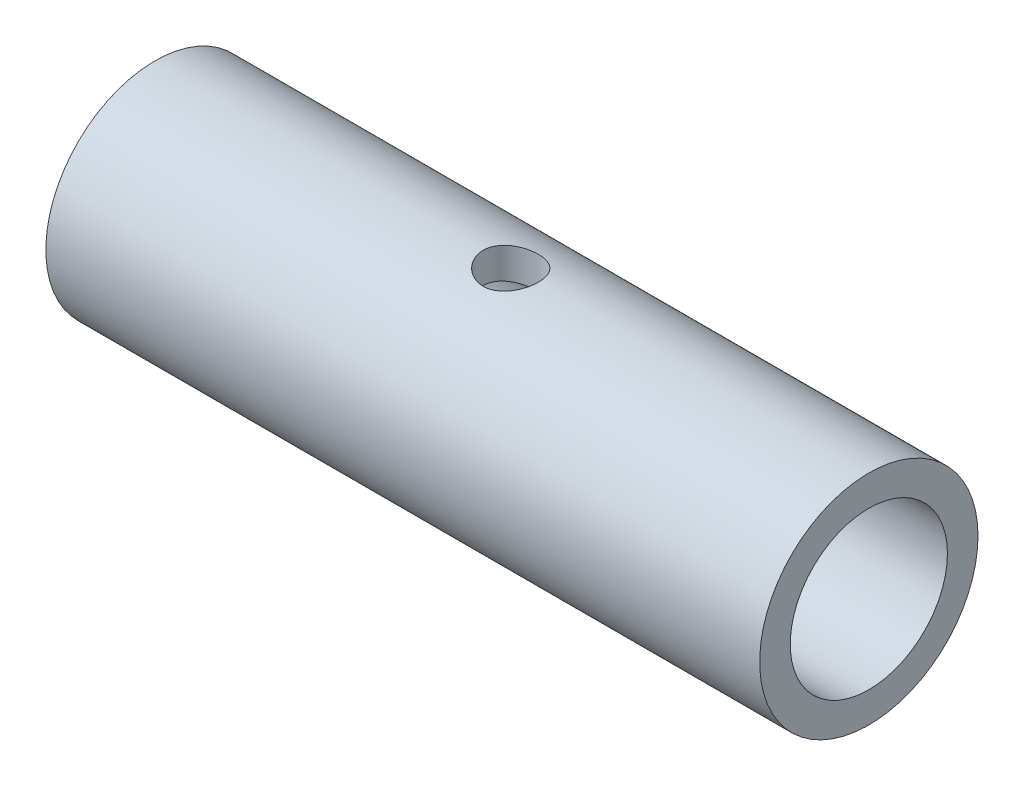
ISO-10303-21;
HEADER;
FILE_DESCRIPTION(('STEP AP214'),'2;1');
FILE_NAME('part.step','',(''),(''),'','','');
FILE_SCHEMA(('AUTOMOTIVE_DESIGN { 1 0 10303 214 1 1 1 1 }'));
ENDSEC;
DATA;
#1=APPLICATION_CONTEXT('core data for automotive mechanical design processes');
#2=APPLICATION_PROTOCOL_DEFINITION('international standard','automotive_design',2000,#1);
#3=PRODUCT_CONTEXT('',#1,'mechanical');
#4=PRODUCT('Part','Part','',(#3));
#5=PRODUCT_RELATED_PRODUCT_CATEGORY('part','',(#4));
#6=PRODUCT_DEFINITION_FORMATION('','',#4);
#7=PRODUCT_DEFINITION_CONTEXT('part definition',#1,'design');
#8=PRODUCT_DEFINITION('design','',#6,#7);
#9=PRODUCT_DEFINITION_SHAPE('','',#8);
#10=(LENGTH_UNIT() NAMED_UNIT(*) SI_UNIT(.MILLI.,.METRE.));
#11=(NAMED_UNIT(*) PLANE_ANGLE_UNIT() SI_UNIT($,.RADIAN.));
#12=(NAMED_UNIT(*) SI_UNIT($,.STERADIAN.) SOLID_ANGLE_UNIT());
#13=UNCERTAINTY_MEASURE_WITH_UNIT(LENGTH_MEASURE(1.E-05),#10,'distance_accuracy_value','');
#14=(GEOMETRIC_REPRESENTATION_CONTEXT(3) GLOBAL_UNCERTAINTY_ASSIGNED_CONTEXT((#13)) GLOBAL_UNIT_ASSIGNED_CONTEXT((#10,
#11,#12)) REPRESENTATION_CONTEXT('',''));
#15=CARTESIAN_POINT('',(0.,0.,0.));
#16=DIRECTION('',(0.,0.,1.));
#17=DIRECTION('',(1.,0.,0.));
#18=AXIS2_PLACEMENT_3D('',#15,#16,#17);
#19=CARTESIAN_POINT('',(31.1404,0.,0.));
#20=DIRECTION('',(1.,0.,0.));
#21=DIRECTION('',(0.,0.,-1.));
#22=AXIS2_PLACEMENT_3D('',#19,#20,#21);
#23=PLANE('',#22);
#24=CARTESIAN_POINT('',(31.1404,0.,0.));
#25=DIRECTION('',(1.,0.,0.));
#26=DIRECTION('',(0.,0.,-1.));
#27=AXIS2_PLACEMENT_3D('',#24,#25,#26);
#28=CIRCLE('',#27,9.525);
#29=CARTESIAN_POINT('',(31.1404,0.,-9.525));
#30=VERTEX_POINT('',#29);
#31=EDGE_CURVE('E10',#30,#30,#28,.T.);
#32=ORIENTED_EDGE('',*,*,#31,.T.);
#33=EDGE_LOOP('',(#32));
#34=FACE_BOUND('',#33,.T.);
#35=CARTESIAN_POINT('',(31.1404,0.,0.));
#36=DIRECTION('',(1.,0.,0.));
#37=DIRECTION('',(0.,0.,-1.));
#38=AXIS2_PLACEMENT_3D('',#35,#36,#37);
#39=CIRCLE('',#38,6.858);
#40=CARTESIAN_POINT('',(31.1404,0.,-6.858));
#41=VERTEX_POINT('',#40);
#42=EDGE_CURVE('E33',#41,#41,#39,.T.);
#43=ORIENTED_EDGE('',*,*,#42,.F.);
#44=EDGE_LOOP('',(#43));
#45=FACE_BOUND('',#44,.T.);
#46=ADVANCED_FACE('F15',(#34,#45),#23,.T.);
#47=CARTESIAN_POINT('',(-31.1404,0.,0.));
#48=DIRECTION('',(1.,0.,0.));
#49=DIRECTION('',(0.,0.,-1.));
#50=AXIS2_PLACEMENT_3D('',#47,#48,#49);
#51=PLANE('',#50);
#52=CARTESIAN_POINT('',(-31.1404,0.,0.));
#53=DIRECTION('',(1.,0.,0.));
#54=DIRECTION('',(0.,0.,-1.));
#55=AXIS2_PLACEMENT_3D('',#52,#53,#54);
#56=CIRCLE('',#55,9.525);
#57=CARTESIAN_POINT('',(-31.1404,0.,-9.525));
#58=VERTEX_POINT('',#57);
#59=EDGE_CURVE('E28',#58,#58,#56,.T.);
#60=ORIENTED_EDGE('',*,*,#59,.F.);
#61=EDGE_LOOP('',(#60));
#62=FACE_BOUND('',#61,.T.);
#63=CARTESIAN_POINT('',(-31.1404,0.,0.));
#64=DIRECTION('',(1.,0.,0.));
#65=DIRECTION('',(0.,0.,-1.));
#66=AXIS2_PLACEMENT_3D('',#63,#64,#65);
#67=CIRCLE('',#66,6.858);
#68=CARTESIAN_POINT('',(-31.1404,0.,-6.858));
#69=VERTEX_POINT('',#68);
#70=EDGE_CURVE('E62',#69,#69,#67,.T.);
#71=ORIENTED_EDGE('',*,*,#70,.T.);
#72=EDGE_LOOP('',(#71));
#73=FACE_BOUND('',#72,.T.);
#74=ADVANCED_FACE('F70',(#62,#73),#51,.F.);
#75=CARTESIAN_POINT('',(31.1404,0.,0.));
#76=DIRECTION('',(-1.,0.,0.));
#77=DIRECTION('',(0.,0.,1.));
#78=AXIS2_PLACEMENT_3D('',#75,#76,#77);
#79=CYLINDRICAL_SURFACE('',#78,9.525);
#80=CARTESIAN_POINT('',(-0.1016,-9.21428543078627,2.413));
#81=CARTESIAN_POINT('',(0.0315844394207791,-9.21428793639697,2.41299632192232));
#82=CARTESIAN_POINT('',(0.16480921992987,-9.21720456734644,2.40193585700803));
#83=CARTESIAN_POINT('',(0.427428753186837,-9.22852516961048,2.35805935843865));
#84=CARTESIAN_POINT('',(0.556821294072152,-9.23693224773675,2.32523100709667));
#85=CARTESIAN_POINT('',(0.807939641453416,-9.25822186105432,2.23895287767477));
#86=CARTESIAN_POINT('',(0.929675273373908,-9.27109851648187,2.18553018145421));
#87=CARTESIAN_POINT('',(1.16247058356803,-9.29986905667627,2.05966279386624));
#88=CARTESIAN_POINT('',(1.27352973376755,-9.31576309057146,1.98721716225777));
#89=CARTESIAN_POINT('',(1.48432848357206,-9.34917957421871,1.82361180530555));
#90=CARTESIAN_POINT('',(1.5837912931329,-9.36672860771954,1.73210080665042));
#91=CARTESIAN_POINT('',(1.76613388007255,-9.40124737523484,1.53371876949773));
#92=CARTESIAN_POINT('',(1.84901207509717,-9.41821705384452,1.42684626701413));
#93=CARTESIAN_POINT('',(1.99696951661439,-9.44995970089797,1.19887421234851));
#94=CARTESIAN_POINT('',(2.06177621277856,-9.46469764294377,1.07759247133314));
#95=CARTESIAN_POINT('',(2.1699778483772,-9.49001263006886,0.825420528557759));
#96=CARTESIAN_POINT('',(2.21337603451232,-9.50059030602262,0.694531787205158));
#97=CARTESIAN_POINT('',(2.27664036066084,-9.5162050062834,0.42974755564687));
#98=CARTESIAN_POINT('',(2.29697669437608,-9.52135258312599,0.295971040240008));
#99=CARTESIAN_POINT('',(2.31501661758326,-9.52591259152121,0.0268127422067791));
#100=CARTESIAN_POINT('',(2.3127236394845,-9.52532589284768,-0.108568793859064));
#101=CARTESIAN_POINT('',(2.28590682341191,-9.51856549768785,-0.373830809383349));
#102=CARTESIAN_POINT('',(2.26189060594633,-9.5125193803891,-0.503766349240137));
#103=CARTESIAN_POINT('',(2.19312578957057,-9.49566843408202,-0.757699469921245));
#104=CARTESIAN_POINT('',(2.14837607068301,-9.4848633480064,-0.881696729573661));
#105=CARTESIAN_POINT('',(2.03900807609398,-9.45951452853285,-1.12156270540417));
#106=CARTESIAN_POINT('',(1.97421046851789,-9.44493725301621,-1.2373459641052));
#107=CARTESIAN_POINT('',(1.82672240727533,-9.41362324597575,-1.45657235599479));
#108=CARTESIAN_POINT('',(1.74402876630491,-9.39688612999653,-1.56001328590286));
#109=CARTESIAN_POINT('',(1.56037992817606,-9.36252584411429,-1.75464665530158));
#110=CARTESIAN_POINT('',(1.45898130345457,-9.34489097594419,-1.84541908431528));
#111=CARTESIAN_POINT('',(1.24221670731962,-9.31114696923562,-2.0087667175165));
#112=CARTESIAN_POINT('',(1.12685004698427,-9.29503790602175,-2.08134102360606));
#113=CARTESIAN_POINT('',(0.884583447650895,-9.266126534717,-2.20651099248131));
#114=CARTESIAN_POINT('',(0.757627756592238,-9.25334148762954,-2.25900301050085));
#115=CARTESIAN_POINT('',(0.496290885833842,-9.2327456803203,-2.34176662795152));
#116=CARTESIAN_POINT('',(0.361911350731128,-9.22493382315658,-2.37204312770877));
#117=CARTESIAN_POINT('',(0.0934428941820414,-9.21539979817428,-2.40881412167068));
#118=CARTESIAN_POINT('',(-0.0405552664227236,-9.21351837999779,-2.4159307043807));
#119=CARTESIAN_POINT('',(-0.307825152196355,-9.2156243388942,-2.40788507222969));
#120=CARTESIAN_POINT('',(-0.441096945038221,-9.21961115952874,-2.39272496968961));
#121=CARTESIAN_POINT('',(-0.700804149157229,-9.23285153774554,-2.34110235461956));
#122=CARTESIAN_POINT('',(-0.827317045951347,-9.24201491537009,-2.30500431769763));
#123=CARTESIAN_POINT('',(-1.07249534671854,-9.26448982291117,-2.21293574281116));
#124=CARTESIAN_POINT('',(-1.19115979994686,-9.27780185427572,-2.15696280245184));
#125=CARTESIAN_POINT('',(-1.41990212143673,-9.30740778215537,-2.02543888640469));
#126=CARTESIAN_POINT('',(-1.52975966415047,-9.32375619814284,-1.94951727369401));
#127=CARTESIAN_POINT('',(-1.73540390876579,-9.35746016799382,-1.78071798430517));
#128=CARTESIAN_POINT('',(-1.83118822851138,-9.37481589167099,-1.68783744296504));
#129=CARTESIAN_POINT('',(-2.00849919906283,-9.40912030642822,-1.48489744966154));
#130=CARTESIAN_POINT('',(-2.08959482340314,-9.42604698269254,-1.37445698064202));
#131=CARTESIAN_POINT('',(-2.232090308165,-9.45712393176532,-1.14116545157765));
#132=CARTESIAN_POINT('',(-2.2934912025321,-9.47127435030825,-1.01831504348248));
#133=CARTESIAN_POINT('',(-2.39431442823812,-9.49511464989736,-0.764544855581737));
#134=CARTESIAN_POINT('',(-2.43389628681235,-9.50483681411777,-0.633691632901923));
#135=CARTESIAN_POINT('',(-2.49043389482846,-9.51886666860968,-0.366911091116921));
#136=CARTESIAN_POINT('',(-2.50739413616636,-9.52317543379117,-0.230984784868422));
#137=CARTESIAN_POINT('',(-2.51794873818627,-9.52584778637719,0.0380386630809051));
#138=CARTESIAN_POINT('',(-2.51217842644525,-9.52437303058764,0.171109645535167));
#139=CARTESIAN_POINT('',(-2.4788948187005,-9.51600391452607,0.434320605183303));
#140=CARTESIAN_POINT('',(-2.45138220134556,-9.50910972341246,0.564460673730231));
#141=CARTESIAN_POINT('',(-2.37573945477103,-9.49070278384709,0.817431154638578));
#142=CARTESIAN_POINT('',(-2.32772696442795,-9.47921641128704,0.940298787932478));
#143=CARTESIAN_POINT('',(-2.21255366924199,-9.45283293445416,1.17630405118778));
#144=CARTESIAN_POINT('',(-2.14539039455034,-9.43793539029633,1.28944042367131));
#145=CARTESIAN_POINT('',(-1.99189971163549,-9.40587755499541,1.505773581814));
#146=CARTESIAN_POINT('',(-1.90514314091863,-9.38867077305308,1.60865898042801));
#147=CARTESIAN_POINT('',(-1.71575802071469,-9.35413865454271,1.79862656259618));
#148=CARTESIAN_POINT('',(-1.61312542527418,-9.33681328883271,1.8857047053927));
#149=CARTESIAN_POINT('',(-1.39251823919917,-9.30362422803912,2.04323817927316));
#150=CARTESIAN_POINT('',(-1.27428585376251,-9.28779518248159,2.11334038795562));
#151=CARTESIAN_POINT('',(-1.02732909089317,-9.25986152143217,2.23256926978175));
#152=CARTESIAN_POINT('',(-0.898612277627339,-9.24775425038818,2.28171090841207));
#153=CARTESIAN_POINT('',(-0.658740282114636,-9.23048638328067,2.35047862082388));
#154=CARTESIAN_POINT('',(-0.54871279412488,-9.22445740270272,2.37387227850036));
#155=CARTESIAN_POINT('',(-0.326332970866215,-9.21635604825495,2.40513381780153));
#156=CARTESIAN_POINT('',(-0.213980846782257,-9.2142833165554,2.41300310355689));
#157=CARTESIAN_POINT('',(-0.1016,-9.21428543078627,2.413));
#158=B_SPLINE_CURVE_WITH_KNOTS('',3,(#80,#81,#82,#83,#84,#85,#86,#87,#88,#89,#90,#91,#92,#93,
#94,#95,#96,#97,#98,#99,#100,#101,#102,#103,#104,#105,#106,#107,#108,#109,#110,#111,#112,#113,
#114,#115,#116,#117,#118,#119,#120,#121,#122,#123,#124,#125,#126,#127,#128,#129,#130,#131,#132,
#133,#134,#135,#136,#137,#138,#139,#140,#141,#142,#143,#144,#145,#146,#147,#148,#149,#150,#151,
#152,#153,#154,#155,#156,#157),.UNSPECIFIED.,.T.,.F.,(4,2,2,2,2,2,2,2,2,2,2,2,2,2,2,2,2,2,2,2,2,
2,2,2,2,2,2,2,2,2,2,2,2,2,2,2,2,2,4),(0.,0.399140516714164,0.798507086076572,1.19735026433763,
1.59621315981563,2.00320412111307,2.41023389531841,2.82310593728579,3.23591534601336,
3.64014776292274,4.04431886688575,4.43928274266977,4.83426795600713,5.23289385203752,
5.63159080230733,6.04136176167382,6.45115293972214,6.86303140292986,7.2748189861491,
7.67545025930634,8.07604354623651,8.46986432753264,8.86373272844319,9.26551179599429,
9.66735879400403,10.0795613190245,10.4917422004504,10.9008680881015,11.3099127249452,
11.7076066497463,12.1052881617038,12.5007176110679,12.896198081477,13.3013667266064,
13.7066387982836,14.1197299114439,14.5325255889306,14.8693502740303,15.2061444929985),.UNSPECIFIED.);
#159=CARTESIAN_POINT('',(-0.1016,-9.21428543078627,2.413));
#160=VERTEX_POINT('',#159);
#161=EDGE_CURVE('E57',#160,#160,#158,.T.);
#162=ORIENTED_EDGE('',*,*,#161,.T.);
#163=EDGE_LOOP('',(#162));
#164=FACE_BOUND('',#163,.T.);
#165=CARTESIAN_POINT('',(-0.1016,9.21428543078626,2.413));
#166=CARTESIAN_POINT('',(-0.23478443942078,9.21428793639696,2.41299632192232));
#167=CARTESIAN_POINT('',(-0.36800921992987,9.21720456734644,2.40193585700803));
#168=CARTESIAN_POINT('',(-0.630628753186837,9.22852516961048,2.35805935843865));
#169=CARTESIAN_POINT('',(-0.760021294072152,9.23693224773675,2.32523100709667));
#170=CARTESIAN_POINT('',(-1.01113964145342,9.25822186105432,2.23895287767477));
#171=CARTESIAN_POINT('',(-1.13287527337391,9.27109851648187,2.18553018145421));
#172=CARTESIAN_POINT('',(-1.36567058356803,9.29986905667627,2.05966279386624));
#173=CARTESIAN_POINT('',(-1.47672973376755,9.31576309057146,1.98721716225777));
#174=CARTESIAN_POINT('',(-1.68752848357206,9.34917957421871,1.82361180530555));
#175=CARTESIAN_POINT('',(-1.7869912931329,9.36672860771954,1.73210080665042));
#176=CARTESIAN_POINT('',(-1.96933388007255,9.40124737523484,1.53371876949773));
#177=CARTESIAN_POINT('',(-2.05221207509717,9.41821705384452,1.42684626701413));
#178=CARTESIAN_POINT('',(-2.20016951661439,9.44995970089797,1.19887421234851));
#179=CARTESIAN_POINT('',(-2.26497621277856,9.46469764294377,1.07759247133314));
#180=CARTESIAN_POINT('',(-2.3731778483772,9.49001263006886,0.82542052855776));
#181=CARTESIAN_POINT('',(-2.41657603451232,9.50059030602262,0.694531787205159));
#182=CARTESIAN_POINT('',(-2.47984036066084,9.5162050062834,0.429747555646871));
#183=CARTESIAN_POINT('',(-2.50017669437608,9.52135258312599,0.295971040240009));
#184=CARTESIAN_POINT('',(-2.51821661758326,9.52591259152121,0.0268127422067798));
#185=CARTESIAN_POINT('',(-2.5159236394845,9.52532589284768,-0.108568793859063));
#186=CARTESIAN_POINT('',(-2.48910682341191,9.51856549768785,-0.373830809383349));
#187=CARTESIAN_POINT('',(-2.46509060594633,9.5125193803891,-0.503766349240137));
#188=CARTESIAN_POINT('',(-2.39632578957057,9.49566843408202,-0.757699469921245));
#189=CARTESIAN_POINT('',(-2.35157607068301,9.4848633480064,-0.881696729573661));
#190=CARTESIAN_POINT('',(-2.24220807609398,9.45951452853285,-1.12156270540417));
#191=CARTESIAN_POINT('',(-2.17741046851789,9.44493725301621,-1.2373459641052));
#192=CARTESIAN_POINT('',(-2.02992240727533,9.41362324597575,-1.45657235599479));
#193=CARTESIAN_POINT('',(-1.94722876630491,9.39688612999653,-1.56001328590286));
#194=CARTESIAN_POINT('',(-1.76357992817606,9.36252584411429,-1.75464665530158));
#195=CARTESIAN_POINT('',(-1.66218130345457,9.34489097594419,-1.84541908431528));
#196=CARTESIAN_POINT('',(-1.44541670731962,9.31114696923562,-2.0087667175165));
#197=CARTESIAN_POINT('',(-1.33005004698427,9.29503790602175,-2.08134102360606));
#198=CARTESIAN_POINT('',(-1.08778344765089,9.266126534717,-2.20651099248131));
#199=CARTESIAN_POINT('',(-0.960827756592238,9.25334148762954,-2.25900301050085));
#200=CARTESIAN_POINT('',(-0.699490885833843,9.2327456803203,-2.34176662795152));
#201=CARTESIAN_POINT('',(-0.565111350731128,9.22493382315658,-2.37204312770877));
#202=CARTESIAN_POINT('',(-0.296642894182041,9.21539979817428,-2.40881412167068));
#203=CARTESIAN_POINT('',(-0.162644733577277,9.21351837999779,-2.4159307043807));
#204=CARTESIAN_POINT('',(0.104625152196355,9.2156243388942,-2.40788507222969));
#205=CARTESIAN_POINT('',(0.237896945038222,9.21961115952874,-2.39272496968961));
#206=CARTESIAN_POINT('',(0.497604149157229,9.23285153774554,-2.34110235461956));
#207=CARTESIAN_POINT('',(0.624117045951346,9.24201491537009,-2.30500431769763));
#208=CARTESIAN_POINT('',(0.869295346718542,9.26448982291117,-2.21293574281115));
#209=CARTESIAN_POINT('',(0.987959799946855,9.27780185427572,-2.15696280245184));
#210=CARTESIAN_POINT('',(1.21670212143673,9.30740778215537,-2.02543888640469));
#211=CARTESIAN_POINT('',(1.32655966415047,9.32375619814284,-1.94951727369401));
#212=CARTESIAN_POINT('',(1.53220390876579,9.35746016799382,-1.78071798430517));
#213=CARTESIAN_POINT('',(1.62798822851138,9.37481589167099,-1.68783744296504));
#214=CARTESIAN_POINT('',(1.80529919906283,9.40912030642822,-1.48489744966154));
#215=CARTESIAN_POINT('',(1.88639482340314,9.42604698269254,-1.37445698064202));
#216=CARTESIAN_POINT('',(2.028890308165,9.45712393176532,-1.14116545157765));
#217=CARTESIAN_POINT('',(2.0902912025321,9.47127435030825,-1.01831504348248));
#218=CARTESIAN_POINT('',(2.19111442823812,9.49511464989736,-0.764544855581737));
#219=CARTESIAN_POINT('',(2.23069628681234,9.50483681411777,-0.633691632901922));
#220=CARTESIAN_POINT('',(2.28723389482846,9.51886666860968,-0.36691109111692));
#221=CARTESIAN_POINT('',(2.30419413616636,9.52317543379117,-0.230984784868422));
#222=CARTESIAN_POINT('',(2.31474873818627,9.52584778637719,0.0380386630809051));
#223=CARTESIAN_POINT('',(2.30897842644525,9.52437303058764,0.171109645535167));
#224=CARTESIAN_POINT('',(2.2756948187005,9.51600391452607,0.434320605183303));
#225=CARTESIAN_POINT('',(2.24818220134556,9.50910972341246,0.564460673730231));
#226=CARTESIAN_POINT('',(2.17253945477103,9.49070278384709,0.817431154638579));
#227=CARTESIAN_POINT('',(2.12452696442794,9.47921641128704,0.940298787932479));
#228=CARTESIAN_POINT('',(2.00935366924199,9.45283293445416,1.17630405118778));
#229=CARTESIAN_POINT('',(1.94219039455034,9.43793539029633,1.28944042367131));
#230=CARTESIAN_POINT('',(1.78869971163549,9.40587755499542,1.50577358181401));
#231=CARTESIAN_POINT('',(1.70194314091863,9.38867077305308,1.60865898042801));
#232=CARTESIAN_POINT('',(1.51255802071469,9.35413865454271,1.79862656259619));
#233=CARTESIAN_POINT('',(1.40992542527418,9.33681328883271,1.8857047053927));
#234=CARTESIAN_POINT('',(1.18931823919916,9.30362422803912,2.04323817927316));
#235=CARTESIAN_POINT('',(1.07108585376251,9.28779518248159,2.11334038795562));
#236=CARTESIAN_POINT('',(0.824129090893167,9.25986152143217,2.23256926978175));
#237=CARTESIAN_POINT('',(0.695412277627336,9.24775425038818,2.28171090841207));
#238=CARTESIAN_POINT('',(0.455540282114633,9.23048638328067,2.35047862082388));
#239=CARTESIAN_POINT('',(0.345512794124878,9.22445740270272,2.37387227850036));
#240=CARTESIAN_POINT('',(0.123132970866214,9.21635604825495,2.40513381780153));
#241=CARTESIAN_POINT('',(0.0107808467822563,9.2142833165554,2.41300310355689));
#242=CARTESIAN_POINT('',(-0.1016,9.21428543078626,2.413));
#243=B_SPLINE_CURVE_WITH_KNOTS('',3,(#165,#166,#167,#168,#169,#170,#171,#172,#173,#174,#175,
#176,#177,#178,#179,#180,#181,#182,#183,#184,#185,#186,#187,#188,#189,#190,#191,#192,#193,#194,
#195,#196,#197,#198,#199,#200,#201,#202,#203,#204,#205,#206,#207,#208,#209,#210,#211,#212,#213,
#214,#215,#216,#217,#218,#219,#220,#221,#222,#223,#224,#225,#226,#227,#228,#229,#230,#231,#232,
#233,#234,#235,#236,#237,#238,#239,#240,#241,#242),.UNSPECIFIED.,.T.,.F.,(4,2,2,2,2,2,2,2,2,2,2,
2,2,2,2,2,2,2,2,2,2,2,2,2,2,2,2,2,2,2,2,2,2,2,2,2,2,2,4),(0.,0.399140516714164,
0.798507086076572,1.19735026433763,1.59621315981563,2.00320412111307,2.41023389531841,
2.82310593728579,3.23591534601336,3.64014776292273,4.04431886688575,4.43928274266977,
4.83426795600713,5.23289385203752,5.63159080230733,6.04136176167382,6.45115293972214,
6.86303140292986,7.2748189861491,7.67545025930634,8.07604354623651,8.46986432753264,
8.86373272844318,9.26551179599429,9.66735879400403,10.0795613190245,10.4917422004504,
10.9008680881015,11.3099127249452,11.7076066497463,12.1052881617038,12.5007176110679,
12.896198081477,13.3013667266064,13.7066387982836,14.1197299114439,14.5325255889306,
14.8693502740303,15.2061444929985),.UNSPECIFIED.);
#244=CARTESIAN_POINT('',(-0.1016,9.21428543078626,2.413));
#245=VERTEX_POINT('',#244);
#246=EDGE_CURVE('E53',#245,#245,#243,.T.);
#247=ORIENTED_EDGE('',*,*,#246,.T.);
#248=EDGE_LOOP('',(#247));
#249=FACE_BOUND('',#248,.T.);
#250=ORIENTED_EDGE('',*,*,#31,.F.);
#251=EDGE_LOOP('',(#250));
#252=FACE_BOUND('',#251,.T.);
#253=ORIENTED_EDGE('',*,*,#59,.T.);
#254=EDGE_LOOP('',(#253));
#255=FACE_BOUND('',#254,.T.);
#256=ADVANCED_FACE('F17',(#164,#249,#252,#255),#79,.T.);
#257=CARTESIAN_POINT('',(31.1404,0.,0.));
#258=DIRECTION('',(-1.,0.,0.));
#259=DIRECTION('',(0.,0.,1.));
#260=AXIS2_PLACEMENT_3D('',#257,#258,#259);
#261=CYLINDRICAL_SURFACE('',#260,6.858);
#262=CARTESIAN_POINT('',(-0.1016,-6.41946999369886,2.413));
#263=CARTESIAN_POINT('',(0.0293527618917913,-6.41946803680309,2.41300228924528));
#264=CARTESIAN_POINT('',(0.160289591770114,-6.42352070805187,2.40230402916263));
#265=CARTESIAN_POINT('',(0.418254165287777,-6.43919686250801,2.35995937164126));
#266=CARTESIAN_POINT('',(0.545281617892476,-6.45082090794746,2.32831141852575));
#267=CARTESIAN_POINT('',(0.791642055032241,-6.48016362480678,2.2453408537952));
#268=CARTESIAN_POINT('',(0.910990899439506,-6.49786922159086,2.19406042286443));
#269=CARTESIAN_POINT('',(1.1394341149545,-6.53736018556584,2.07342716349615));
#270=CARTESIAN_POINT('',(1.24852583191808,-6.55914660437428,2.00406967483894));
#271=CARTESIAN_POINT('',(1.45812061124449,-6.60541071344454,1.84600768079048));
#272=CARTESIAN_POINT('',(1.55811139078251,-6.62996087494923,1.75664491422206));
#273=CARTESIAN_POINT('',(1.74204191227152,-6.6783772767707,1.56251034508334));
#274=CARTESIAN_POINT('',(1.82597873137061,-6.70224339187594,1.45773574270029));
#275=CARTESIAN_POINT('',(1.977804226814,-6.74745129924572,1.23194427787278));
#276=CARTESIAN_POINT('',(2.04514749632597,-6.76869805285573,1.11053995674252));
#277=CARTESIAN_POINT('',(2.15824816888369,-6.80541206053832,0.857248307478071));
#278=CARTESIAN_POINT('',(2.2040121008749,-6.82088106240613,0.725364164200377));
#279=CARTESIAN_POINT('',(2.27089234930562,-6.84378285304158,0.460234188467397));
#280=CARTESIAN_POINT('',(2.2928881225222,-6.85150157472657,0.327235371586356));
#281=CARTESIAN_POINT('',(2.31441331181462,-6.85905290182181,0.0592254374982949));
#282=CARTESIAN_POINT('',(2.31394916643622,-6.85888776728358,-0.0757850919199757));
#283=CARTESIAN_POINT('',(2.29110590468652,-6.85087866296873,-0.337727391881213));
#284=CARTESIAN_POINT('',(2.26968396359488,-6.84337008472238,-0.464754611872771));
#285=CARTESIAN_POINT('',(2.20712777239434,-6.82194695701712,-0.713280256742418));
#286=CARTESIAN_POINT('',(2.16599215335145,-6.80803196269406,-0.834778297028087));
#287=CARTESIAN_POINT('',(2.06466797047543,-6.77495354836393,-1.07078294978835));
#288=CARTESIAN_POINT('',(2.00422352538858,-6.75572013708334,-1.18516948927064));
#289=CARTESIAN_POINT('',(1.8662145565604,-6.71398317175836,-1.40244500750423));
#290=CARTESIAN_POINT('',(1.78864491304488,-6.69147864046396,-1.50533053401072));
#291=CARTESIAN_POINT('',(1.61385343572165,-6.64416620583444,-1.70235707201577));
#292=CARTESIAN_POINT('',(1.51581860728298,-6.61929938217737,-1.79576377356377));
#293=CARTESIAN_POINT('',(1.30528906177412,-6.57103104899852,-1.9650658056875));
#294=CARTESIAN_POINT('',(1.19279156101209,-6.54762982285939,-2.04095775724431));
#295=CARTESIAN_POINT('',(0.953960298370371,-6.50459797991905,-2.17425368882045));
#296=CARTESIAN_POINT('',(0.827419116602573,-6.48504039383293,-2.23131144753184));
#297=CARTESIAN_POINT('',(0.565659091105594,-6.45275246542151,-2.32304601571246));
#298=CARTESIAN_POINT('',(0.430444422859309,-6.44001886518862,-2.35773350680756));
#299=CARTESIAN_POINT('',(0.162354963773079,-6.4235711713039,-2.40217283995223));
#300=CARTESIAN_POINT('',(0.0296965582454196,-6.41944118148973,-2.41307575250114));
#301=CARTESIAN_POINT('',(-0.235590046278454,-6.4194990882364,-2.41292349621297));
#302=CARTESIAN_POINT('',(-0.368218245784419,-6.42368524365801,-2.40187292374511));
#303=CARTESIAN_POINT('',(-0.624164818083922,-6.43948566613236,-2.3591661174322));
#304=CARTESIAN_POINT('',(-0.747643645234376,-6.45079773571998,-2.32834729299484));
#305=CARTESIAN_POINT('',(-0.987640013477242,-6.47923166677755,-2.24800449261524));
#306=CARTESIAN_POINT('',(-1.10415622980173,-6.49635462976613,-2.19847697003249));
#307=CARTESIAN_POINT('',(-1.33136214965818,-6.53520743346915,-2.08019683864644));
#308=CARTESIAN_POINT('',(-1.441714199193,-6.55707532489289,-2.01084224881655));
#309=CARTESIAN_POINT('',(-1.6496272240603,-6.60270206180711,-1.85554044382967));
#310=CARTESIAN_POINT('',(-1.74718400580762,-6.62646152317057,-1.76958781145273));
#311=CARTESIAN_POINT('',(-1.93224914472072,-6.67476222338438,-1.57796777428888));
#312=CARTESIAN_POINT('',(-2.01891853131635,-6.69927536081031,-1.47148043391289));
#313=CARTESIAN_POINT('',(-2.17323204536872,-6.74505826731624,-1.24486808884559));
#314=CARTESIAN_POINT('',(-2.24087658412618,-6.76632810650898,-1.12474337906123));
#315=CARTESIAN_POINT('',(-2.35465831785338,-6.80315920567997,-0.874674230467651));
#316=CARTESIAN_POINT('',(-2.40091240828047,-6.81875139115867,-0.744787783575028));
#317=CARTESIAN_POINT('',(-2.4706976356566,-6.84259672512985,-0.478414438588867));
#318=CARTESIAN_POINT('',(-2.49423802666424,-6.85085286238051,-0.341930252379054));
#319=CARTESIAN_POINT('',(-2.51702169323287,-6.85884506415907,-0.0738682227472687));
#320=CARTESIAN_POINT('',(-2.51746348123855,-6.85900139751255,0.0575962427297921));
#321=CARTESIAN_POINT('',(-2.49704842715223,-6.85183746377642,0.318640014079514));
#322=CARTESIAN_POINT('',(-2.4761936575792,-6.84451792421697,0.448219502148126));
#323=CARTESIAN_POINT('',(-2.41459614260088,-6.82339623233272,0.699292539081117));
#324=CARTESIAN_POINT('',(-2.37424636669136,-6.80972236661764,0.820894082135225));
#325=CARTESIAN_POINT('',(-2.27517887486929,-6.77730449369903,1.05563385651689));
#326=CARTESIAN_POINT('',(-2.21645773642079,-6.75855954185375,1.16877050598675));
#327=CARTESIAN_POINT('',(-2.07966379060745,-6.71698797510637,1.38823837672135));
#328=CARTESIAN_POINT('',(-2.00091968428245,-6.69402964167263,1.49412583578466));
#329=CARTESIAN_POINT('',(-1.82741964925282,-6.64688543913843,1.69156731004538));
#330=CARTESIAN_POINT('',(-1.7326583268294,-6.62269915845865,1.78311647681933));
#331=CARTESIAN_POINT('',(-1.52473180413766,-6.57451415683132,1.95349066580963));
#332=CARTESIAN_POINT('',(-1.41093072801798,-6.55057275593336,2.03155857789187));
#333=CARTESIAN_POINT('',(-1.17106741098975,-6.50687954460864,2.16744075713882));
#334=CARTESIAN_POINT('',(-1.04500656612844,-6.48712725797095,2.22525732692691));
#335=CARTESIAN_POINT('',(-0.784961879900738,-6.45446283978022,2.31829871972636));
#336=CARTESIAN_POINT('',(-0.651041353188193,-6.44150266215901,2.35368261168955));
#337=CARTESIAN_POINT('',(-0.378606508604039,-6.42400922155763,2.40102662747606));
#338=CARTESIAN_POINT('',(-0.240094344348847,-6.41947206329245,2.41299757891686));
#339=CARTESIAN_POINT('',(-0.1016,-6.41946999369886,2.413));
#340=B_SPLINE_CURVE_WITH_KNOTS('',3,(#262,#263,#264,#265,#266,#267,#268,#269,#270,#271,#272,
#273,#274,#275,#276,#277,#278,#279,#280,#281,#282,#283,#284,#285,#286,#287,#288,#289,#290,#291,
#292,#293,#294,#295,#296,#297,#298,#299,#300,#301,#302,#303,#304,#305,#306,#307,#308,#309,#310,
#311,#312,#313,#314,#315,#316,#317,#318,#319,#320,#321,#322,#323,#324,#325,#326,#327,#328,#329,
#330,#331,#332,#333,#334,#335,#336,#337,#338,#339),.UNSPECIFIED.,.T.,.F.,(4,2,2,2,2,2,2,2,2,2,2,
2,2,2,2,2,2,2,2,2,2,2,2,2,2,2,2,2,2,2,2,2,2,2,2,2,2,2,4),(0.,0.392344180891874,
0.784717499643502,1.17625248675133,1.56788851059697,1.9750582891819,2.38230212839875,
2.80153911273494,3.22064917313412,3.62365608562375,4.0265474695085,4.411858104656,
4.79719549996823,5.18786742418496,5.57865630279065,5.98979418246255,6.40101131439327,
6.81941385206127,7.23761645761571,7.63508401395676,8.03246836186377,8.4140405204528,
8.7956850506722,9.19043998595355,9.58532397860401,10.0017589882339,10.4181849942073,
10.8323075931194,11.2462613980825,11.6387139370268,12.0311282872722,12.4159431878128,
12.8008298210776,13.200880975965,13.6010671154832,14.019245145711,14.4373756127052,
14.8525069619284,15.2674462828463),.UNSPECIFIED.);
#341=CARTESIAN_POINT('',(-0.1016,-6.41946999369886,2.413));
#342=VERTEX_POINT('',#341);
#343=EDGE_CURVE('E20',#342,#342,#340,.T.);
#344=ORIENTED_EDGE('',*,*,#343,.F.);
#345=EDGE_LOOP('',(#344));
#346=FACE_BOUND('',#345,.T.);
#347=CARTESIAN_POINT('',(-0.1016,6.41946999369886,2.413));
#348=CARTESIAN_POINT('',(-0.232552761891792,6.41946803680309,2.41300228924528));
#349=CARTESIAN_POINT('',(-0.363489591770114,6.42352070805187,2.40230402916263));
#350=CARTESIAN_POINT('',(-0.621454165287777,6.43919686250801,2.35995937164126));
#351=CARTESIAN_POINT('',(-0.748481617892476,6.45082090794746,2.32831141852575));
#352=CARTESIAN_POINT('',(-0.994842055032241,6.48016362480678,2.24534085379521));
#353=CARTESIAN_POINT('',(-1.11419089943951,6.49786922159086,2.19406042286443));
#354=CARTESIAN_POINT('',(-1.3426341149545,6.53736018556584,2.07342716349615));
#355=CARTESIAN_POINT('',(-1.45172583191808,6.55914660437428,2.00406967483894));
#356=CARTESIAN_POINT('',(-1.66132061124449,6.60541071344454,1.84600768079048));
#357=CARTESIAN_POINT('',(-1.76131139078251,6.62996087494923,1.75664491422206));
#358=CARTESIAN_POINT('',(-1.94524191227152,6.67837727677069,1.56251034508335));
#359=CARTESIAN_POINT('',(-2.02917873137061,6.70224339187594,1.45773574270029));
#360=CARTESIAN_POINT('',(-2.181004226814,6.74745129924572,1.23194427787279));
#361=CARTESIAN_POINT('',(-2.24834749632597,6.76869805285573,1.11053995674252));
#362=CARTESIAN_POINT('',(-2.36144816888369,6.80541206053832,0.857248307478073));
#363=CARTESIAN_POINT('',(-2.4072121008749,6.82088106240612,0.725364164200379));
#364=CARTESIAN_POINT('',(-2.47409234930562,6.84378285304158,0.460234188467399));
#365=CARTESIAN_POINT('',(-2.4960881225222,6.85150157472657,0.327235371586358));
#366=CARTESIAN_POINT('',(-2.51761331181463,6.85905290182181,0.0592254374982968));
#367=CARTESIAN_POINT('',(-2.51714916643622,6.85888776728358,-0.0757850919199737));
#368=CARTESIAN_POINT('',(-2.49430590468652,6.85087866296873,-0.337727391881211));
#369=CARTESIAN_POINT('',(-2.47288396359489,6.84337008472238,-0.464754611872769));
#370=CARTESIAN_POINT('',(-2.41032777239434,6.82194695701712,-0.713280256742417));
#371=CARTESIAN_POINT('',(-2.36919215335145,6.80803196269406,-0.834778297028086));
#372=CARTESIAN_POINT('',(-2.26786797047543,6.77495354836393,-1.07078294978835));
#373=CARTESIAN_POINT('',(-2.20742352538858,6.75572013708334,-1.18516948927063));
#374=CARTESIAN_POINT('',(-2.0694145565604,6.71398317175836,-1.40244500750423));
#375=CARTESIAN_POINT('',(-1.99184491304488,6.69147864046396,-1.50533053401072));
#376=CARTESIAN_POINT('',(-1.81705343572165,6.64416620583444,-1.70235707201577));
#377=CARTESIAN_POINT('',(-1.71901860728298,6.61929938217737,-1.79576377356377));
#378=CARTESIAN_POINT('',(-1.50848906177412,6.57103104899852,-1.9650658056875));
#379=CARTESIAN_POINT('',(-1.39599156101209,6.54762982285939,-2.04095775724431));
#380=CARTESIAN_POINT('',(-1.15716029837037,6.50459797991905,-2.17425368882045));
#381=CARTESIAN_POINT('',(-1.03061911660257,6.48504039383293,-2.23131144753184));
#382=CARTESIAN_POINT('',(-0.768859091105594,6.45275246542151,-2.32304601571246));
#383=CARTESIAN_POINT('',(-0.633644422859309,6.44001886518862,-2.35773350680756));
#384=CARTESIAN_POINT('',(-0.365554963773081,6.4235711713039,-2.40217283995223));
#385=CARTESIAN_POINT('',(-0.232896558245421,6.41944118148973,-2.41307575250114));
#386=CARTESIAN_POINT('',(0.0323900462784526,6.4194990882364,-2.41292349621297));
#387=CARTESIAN_POINT('',(0.165018245784417,6.42368524365801,-2.40187292374511));
#388=CARTESIAN_POINT('',(0.420964818083919,6.43948566613236,-2.3591661174322));
#389=CARTESIAN_POINT('',(0.544443645234373,6.45079773571998,-2.32834729299484));
#390=CARTESIAN_POINT('',(0.784440013477238,6.47923166677755,-2.24800449261524));
#391=CARTESIAN_POINT('',(0.900956229801731,6.49635462976613,-2.19847697003249));
#392=CARTESIAN_POINT('',(1.12816214965817,6.53520743346915,-2.08019683864644));
#393=CARTESIAN_POINT('',(1.23851419919299,6.55707532489289,-2.01084224881655));
#394=CARTESIAN_POINT('',(1.4464272240603,6.60270206180711,-1.85554044382967));
#395=CARTESIAN_POINT('',(1.54398400580762,6.62646152317057,-1.76958781145273));
#396=CARTESIAN_POINT('',(1.72904914472071,6.67476222338437,-1.57796777428889));
#397=CARTESIAN_POINT('',(1.81571853131635,6.69927536081031,-1.47148043391289));
#398=CARTESIAN_POINT('',(1.97003204536871,6.74505826731624,-1.24486808884559));
#399=CARTESIAN_POINT('',(2.03767658412618,6.76632810650897,-1.12474337906123));
#400=CARTESIAN_POINT('',(2.15145831785338,6.80315920567997,-0.874674230467654));
#401=CARTESIAN_POINT('',(2.19771240828047,6.81875139115867,-0.744787783575031));
#402=CARTESIAN_POINT('',(2.2674976356566,6.84259672512985,-0.478414438588869));
#403=CARTESIAN_POINT('',(2.29103802666424,6.85085286238051,-0.341930252379056));
#404=CARTESIAN_POINT('',(2.31382169323287,6.85884506415907,-0.0738682227472709));
#405=CARTESIAN_POINT('',(2.31426348123855,6.85900139751255,0.0575962427297904));
#406=CARTESIAN_POINT('',(2.29384842715223,6.85183746377642,0.318640014079513));
#407=CARTESIAN_POINT('',(2.2729936575792,6.84451792421697,0.448219502148124));
#408=CARTESIAN_POINT('',(2.21139614260088,6.82339623233272,0.699292539081115));
#409=CARTESIAN_POINT('',(2.17104636669136,6.80972236661764,0.820894082135224));
#410=CARTESIAN_POINT('',(2.07197887486929,6.77730449369903,1.05563385651689));
#411=CARTESIAN_POINT('',(2.01325773642079,6.75855954185375,1.16877050598675));
#412=CARTESIAN_POINT('',(1.87646379060745,6.71698797510637,1.38823837672135));
#413=CARTESIAN_POINT('',(1.79771968428245,6.69402964167263,1.49412583578466));
#414=CARTESIAN_POINT('',(1.62421964925282,6.64688543913843,1.69156731004538));
#415=CARTESIAN_POINT('',(1.5294583268294,6.62269915845865,1.78311647681933));
#416=CARTESIAN_POINT('',(1.32153180413766,6.57451415683132,1.95349066580963));
#417=CARTESIAN_POINT('',(1.20773072801798,6.55057275593336,2.03155857789187));
#418=CARTESIAN_POINT('',(0.967867410989751,6.50687954460864,2.16744075713881));
#419=CARTESIAN_POINT('',(0.841806566128441,6.48712725797095,2.22525732692691));
#420=CARTESIAN_POINT('',(0.581761879900738,6.45446283978022,2.31829871972636));
#421=CARTESIAN_POINT('',(0.447841353188193,6.44150266215901,2.35368261168955));
#422=CARTESIAN_POINT('',(0.175406508604038,6.42400922155763,2.40102662747606));
#423=CARTESIAN_POINT('',(0.0368943443488467,6.41947206329244,2.41299757891686));
#424=CARTESIAN_POINT('',(-0.1016,6.41946999369886,2.413));
#425=B_SPLINE_CURVE_WITH_KNOTS('',3,(#347,#348,#349,#350,#351,#352,#353,#354,#355,#356,#357,
#358,#359,#360,#361,#362,#363,#364,#365,#366,#367,#368,#369,#370,#371,#372,#373,#374,#375,#376,
#377,#378,#379,#380,#381,#382,#383,#384,#385,#386,#387,#388,#389,#390,#391,#392,#393,#394,#395,
#396,#397,#398,#399,#400,#401,#402,#403,#404,#405,#406,#407,#408,#409,#410,#411,#412,#413,#414,
#415,#416,#417,#418,#419,#420,#421,#422,#423,#424),.UNSPECIFIED.,.T.,.F.,(4,2,2,2,2,2,2,2,2,2,2,
2,2,2,2,2,2,2,2,2,2,2,2,2,2,2,2,2,2,2,2,2,2,2,2,2,2,2,4),(0.,0.392344180891873,
0.784717499643502,1.17625248675133,1.56788851059697,1.9750582891819,2.38230212839874,
2.80153911273494,3.22064917313411,3.62365608562375,4.02654746950849,4.411858104656,
4.79719549996823,5.18786742418496,5.57865630279065,5.98979418246254,6.40101131439327,
6.81941385206127,7.23761645761571,7.63508401395676,8.03246836186377,8.4140405204528,
8.7956850506722,9.19043998595355,9.58532397860401,10.0017589882339,10.4181849942073,
10.8323075931194,11.2462613980825,11.6387139370268,12.0311282872722,12.4159431878128,
12.8008298210776,13.200880975965,13.6010671154832,14.019245145711,14.4373756127052,
14.8525069619284,15.2674462828463),.UNSPECIFIED.);
#426=CARTESIAN_POINT('',(-0.1016,6.41946999369886,2.413));
#427=VERTEX_POINT('',#426);
#428=EDGE_CURVE('E36',#427,#427,#425,.T.);
#429=ORIENTED_EDGE('',*,*,#428,.F.);
#430=EDGE_LOOP('',(#429));
#431=FACE_BOUND('',#430,.T.);
#432=ORIENTED_EDGE('',*,*,#42,.T.);
#433=EDGE_LOOP('',(#432));
#434=FACE_BOUND('',#433,.T.);
#435=ORIENTED_EDGE('',*,*,#70,.F.);
#436=EDGE_LOOP('',(#435));
#437=FACE_BOUND('',#436,.T.);
#438=ADVANCED_FACE('F40',(#346,#431,#434,#437),#261,.F.);
#439=CARTESIAN_POINT('',(-0.1016,-9.525,0.));
#440=DIRECTION('',(0.,1.,0.));
#441=DIRECTION('',(0.,0.,1.));
#442=AXIS2_PLACEMENT_3D('',#439,#440,#441);
#443=CYLINDRICAL_SURFACE('',#442,2.413);
#444=ORIENTED_EDGE('',*,*,#428,.T.);
#445=EDGE_LOOP('',(#444));
#446=FACE_BOUND('',#445,.T.);
#447=ORIENTED_EDGE('',*,*,#246,.F.);
#448=EDGE_LOOP('',(#447));
#449=FACE_BOUND('',#448,.T.);
#450=ADVANCED_FACE('F46',(#446,#449),#443,.F.);
#451=ORIENTED_EDGE('',*,*,#343,.T.);
#452=EDGE_LOOP('',(#451));
#453=FACE_BOUND('',#452,.T.);
#454=ORIENTED_EDGE('',*,*,#161,.F.);
#455=EDGE_LOOP('',(#454));
#456=FACE_BOUND('',#455,.T.);
#457=ADVANCED_FACE('F43',(#453,#456),#443,.F.);
#458=CLOSED_SHELL('',(#46,#74,#256,#438,#450,#457));
#459=MANIFOLD_SOLID_BREP('B1',#458);
#460=ADVANCED_BREP_SHAPE_REPRESENTATION('',(#18,#459),#14);
#461=SHAPE_DEFINITION_REPRESENTATION(#9,#460);
ENDSEC;
END-ISO-10303-21;
